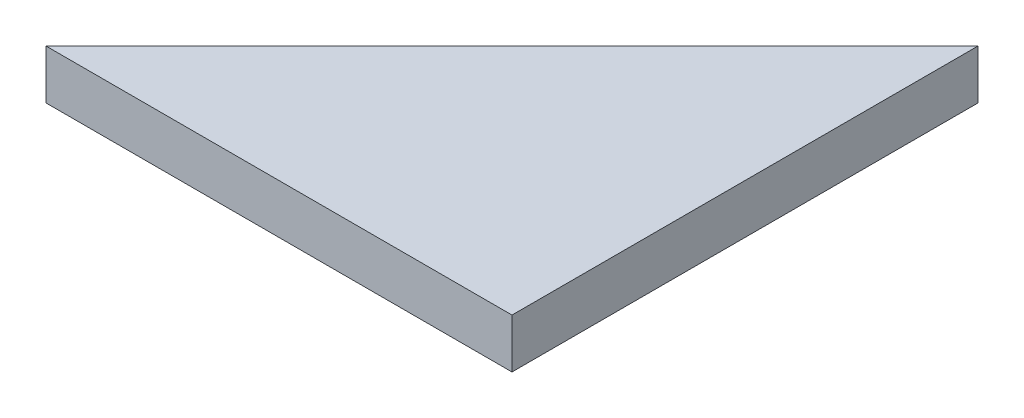
ISO-10303-21;
HEADER;
FILE_DESCRIPTION(('STEP AP214'),'2;1');
FILE_NAME('part.step','',(''),(''),'','','');
FILE_SCHEMA(('AUTOMOTIVE_DESIGN { 1 0 10303 214 1 1 1 1 }'));
ENDSEC;
DATA;
#1=APPLICATION_CONTEXT('core data for automotive mechanical design processes');
#2=APPLICATION_PROTOCOL_DEFINITION('international standard','automotive_design',2000,#1);
#3=PRODUCT_CONTEXT('',#1,'mechanical');
#4=PRODUCT('Part','Part','',(#3));
#5=PRODUCT_RELATED_PRODUCT_CATEGORY('part','',(#4));
#6=PRODUCT_DEFINITION_FORMATION('','',#4);
#7=PRODUCT_DEFINITION_CONTEXT('part definition',#1,'design');
#8=PRODUCT_DEFINITION('design','',#6,#7);
#9=PRODUCT_DEFINITION_SHAPE('','',#8);
#10=(LENGTH_UNIT() NAMED_UNIT(*) SI_UNIT(.MILLI.,.METRE.));
#11=(NAMED_UNIT(*) PLANE_ANGLE_UNIT() SI_UNIT($,.RADIAN.));
#12=(NAMED_UNIT(*) SI_UNIT($,.STERADIAN.) SOLID_ANGLE_UNIT());
#13=UNCERTAINTY_MEASURE_WITH_UNIT(LENGTH_MEASURE(1.E-05),#10,'distance_accuracy_value','');
#14=(GEOMETRIC_REPRESENTATION_CONTEXT(3) GLOBAL_UNCERTAINTY_ASSIGNED_CONTEXT((#13)) GLOBAL_UNIT_ASSIGNED_CONTEXT((#10,
#11,#12)) REPRESENTATION_CONTEXT('',''));
#15=CARTESIAN_POINT('',(0.,0.,0.));
#16=DIRECTION('',(0.,0.,1.));
#17=DIRECTION('',(1.,0.,0.));
#18=AXIS2_PLACEMENT_3D('',#15,#16,#17);
#19=CARTESIAN_POINT('',(0.,6.35,0.));
#20=DIRECTION('',(-1.,0.,0.));
#21=DIRECTION('',(0.,0.,1.));
#22=AXIS2_PLACEMENT_3D('',#19,#20,#21);
#23=PLANE('',#22);
#24=DIRECTION('',(0.,0.,-1.));
#25=VECTOR('',#24,1.);
#26=CARTESIAN_POINT('',(0.,0.,0.));
#27=LINE('',#26,#25);
#28=CARTESIAN_POINT('',(0.,0.,0.));
#29=VERTEX_POINT('',#28);
#30=CARTESIAN_POINT('',(0.,0.,-60.));
#31=VERTEX_POINT('',#30);
#32=EDGE_CURVE('E81',#29,#31,#27,.T.);
#33=ORIENTED_EDGE('',*,*,#32,.T.);
#34=DIRECTION('',(0.,-1.,0.));
#35=VECTOR('',#34,1.);
#36=CARTESIAN_POINT('',(0.,6.35,-60.));
#37=LINE('',#36,#35);
#38=CARTESIAN_POINT('',(0.,6.35,-60.));
#39=VERTEX_POINT('',#38);
#40=EDGE_CURVE('E11',#39,#31,#37,.T.);
#41=ORIENTED_EDGE('',*,*,#40,.F.);
#42=DIRECTION('',(0.,0.,-1.));
#43=VECTOR('',#42,1.);
#44=CARTESIAN_POINT('',(0.,6.35,0.));
#45=LINE('',#44,#43);
#46=CARTESIAN_POINT('',(0.,6.35,0.));
#47=VERTEX_POINT('',#46);
#48=EDGE_CURVE('E74',#47,#39,#45,.T.);
#49=ORIENTED_EDGE('',*,*,#48,.F.);
#50=DIRECTION('',(0.,-1.,0.));
#51=VECTOR('',#50,1.);
#52=CARTESIAN_POINT('',(0.,6.35,0.));
#53=LINE('',#52,#51);
#54=EDGE_CURVE('E82',#47,#29,#53,.T.);
#55=ORIENTED_EDGE('',*,*,#54,.T.);
#56=EDGE_LOOP('',(#33,#41,#49,#55));
#57=FACE_BOUND('',#56,.T.);
#58=ADVANCED_FACE('F34',(#57),#23,.F.);
#59=CARTESIAN_POINT('',(0.,6.35,-60.));
#60=DIRECTION('',(0.707106781186548,0.,0.707106781186547));
#61=DIRECTION('',(0.707106781186547,0.,-0.707106781186548));
#62=AXIS2_PLACEMENT_3D('',#59,#60,#61);
#63=PLANE('',#62);
#64=DIRECTION('',(-0.707106781186547,0.,0.707106781186548));
#65=VECTOR('',#64,1.);
#66=CARTESIAN_POINT('',(0.,0.,-60.));
#67=LINE('',#66,#65);
#68=CARTESIAN_POINT('',(-60.,0.,0.));
#69=VERTEX_POINT('',#68);
#70=EDGE_CURVE('E62',#31,#69,#67,.T.);
#71=ORIENTED_EDGE('',*,*,#70,.T.);
#72=DIRECTION('',(0.,-1.,0.));
#73=VECTOR('',#72,1.);
#74=CARTESIAN_POINT('',(-60.,6.35,0.));
#75=LINE('',#74,#73);
#76=CARTESIAN_POINT('',(-60.,6.35,0.));
#77=VERTEX_POINT('',#76);
#78=EDGE_CURVE('E42',#77,#69,#75,.T.);
#79=ORIENTED_EDGE('',*,*,#78,.F.);
#80=DIRECTION('',(-0.707106781186547,0.,0.707106781186548));
#81=VECTOR('',#80,1.);
#82=CARTESIAN_POINT('',(0.,6.35,-60.));
#83=LINE('',#82,#81);
#84=EDGE_CURVE('E70',#39,#77,#83,.T.);
#85=ORIENTED_EDGE('',*,*,#84,.F.);
#86=ORIENTED_EDGE('',*,*,#40,.T.);
#87=EDGE_LOOP('',(#71,#79,#85,#86));
#88=FACE_BOUND('',#87,.T.);
#89=ADVANCED_FACE('F71',(#88),#63,.F.);
#90=CARTESIAN_POINT('',(-60.,6.35,0.));
#91=DIRECTION('',(0.,0.,-1.));
#92=DIRECTION('',(-1.,0.,0.));
#93=AXIS2_PLACEMENT_3D('',#90,#91,#92);
#94=PLANE('',#93);
#95=DIRECTION('',(1.,0.,0.));
#96=VECTOR('',#95,1.);
#97=CARTESIAN_POINT('',(-60.,0.,0.));
#98=LINE('',#97,#96);
#99=EDGE_CURVE('E67',#69,#29,#98,.T.);
#100=ORIENTED_EDGE('',*,*,#99,.T.);
#101=ORIENTED_EDGE('',*,*,#54,.F.);
#102=DIRECTION('',(1.,0.,0.));
#103=VECTOR('',#102,1.);
#104=CARTESIAN_POINT('',(-60.,6.35,0.));
#105=LINE('',#104,#103);
#106=EDGE_CURVE('E50',#77,#47,#105,.T.);
#107=ORIENTED_EDGE('',*,*,#106,.F.);
#108=ORIENTED_EDGE('',*,*,#78,.T.);
#109=EDGE_LOOP('',(#100,#101,#107,#108));
#110=FACE_BOUND('',#109,.T.);
#111=ADVANCED_FACE('F89',(#110),#94,.F.);
#112=CARTESIAN_POINT('',(0.,6.35,0.));
#113=DIRECTION('',(0.,-1.,0.));
#114=DIRECTION('',(0.,0.,-1.));
#115=AXIS2_PLACEMENT_3D('',#112,#113,#114);
#116=PLANE('',#115);
#117=ORIENTED_EDGE('',*,*,#48,.T.);
#118=ORIENTED_EDGE('',*,*,#84,.T.);
#119=ORIENTED_EDGE('',*,*,#106,.T.);
#120=EDGE_LOOP('',(#117,#118,#119));
#121=FACE_BOUND('',#120,.T.);
#122=ADVANCED_FACE('F77',(#121),#116,.F.);
#123=CARTESIAN_POINT('',(0.,0.,0.));
#124=DIRECTION('',(0.,-1.,0.));
#125=DIRECTION('',(0.,0.,-1.));
#126=AXIS2_PLACEMENT_3D('',#123,#124,#125);
#127=PLANE('',#126);
#128=ORIENTED_EDGE('',*,*,#32,.F.);
#129=ORIENTED_EDGE('',*,*,#99,.F.);
#130=ORIENTED_EDGE('',*,*,#70,.F.);
#131=EDGE_LOOP('',(#128,#129,#130));
#132=FACE_BOUND('',#131,.T.);
#133=ADVANCED_FACE('F90',(#132),#127,.T.);
#134=CLOSED_SHELL('',(#58,#89,#111,#122,#133));
#135=MANIFOLD_SOLID_BREP('B2',#134);
#136=ADVANCED_BREP_SHAPE_REPRESENTATION('',(#18,#135),#14);
#137=SHAPE_DEFINITION_REPRESENTATION(#9,#136);
ENDSEC;
END-ISO-10303-21;
